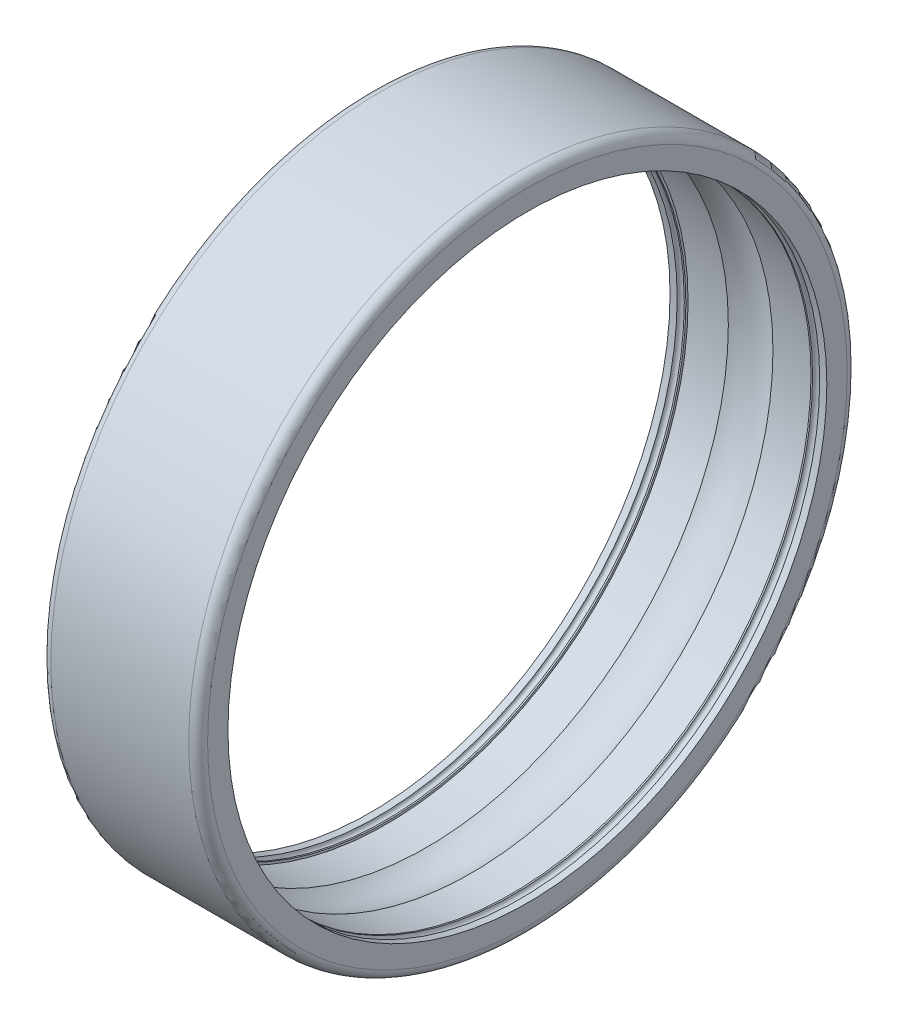
ISO-10303-21;
HEADER;
FILE_DESCRIPTION(('STEP AP214'),'2;1');
FILE_NAME('part.step','',(''),(''),'','','');
FILE_SCHEMA(('AUTOMOTIVE_DESIGN { 1 0 10303 214 1 1 1 1 }'));
ENDSEC;
DATA;
#1=APPLICATION_CONTEXT('core data for automotive mechanical design processes');
#2=APPLICATION_PROTOCOL_DEFINITION('international standard','automotive_design',2000,#1);
#3=PRODUCT_CONTEXT('',#1,'mechanical');
#4=PRODUCT('Part','Part','',(#3));
#5=PRODUCT_RELATED_PRODUCT_CATEGORY('part','',(#4));
#6=PRODUCT_DEFINITION_FORMATION('','',#4);
#7=PRODUCT_DEFINITION_CONTEXT('part definition',#1,'design');
#8=PRODUCT_DEFINITION('design','',#6,#7);
#9=PRODUCT_DEFINITION_SHAPE('','',#8);
#10=(LENGTH_UNIT() NAMED_UNIT(*) SI_UNIT(.MILLI.,.METRE.));
#11=(NAMED_UNIT(*) PLANE_ANGLE_UNIT() SI_UNIT($,.RADIAN.));
#12=(NAMED_UNIT(*) SI_UNIT($,.STERADIAN.) SOLID_ANGLE_UNIT());
#13=UNCERTAINTY_MEASURE_WITH_UNIT(LENGTH_MEASURE(1.E-05),#10,'distance_accuracy_value','');
#14=(GEOMETRIC_REPRESENTATION_CONTEXT(3) GLOBAL_UNCERTAINTY_ASSIGNED_CONTEXT((#13)) GLOBAL_UNIT_ASSIGNED_CONTEXT((#10,
#11,#12)) REPRESENTATION_CONTEXT('',''));
#15=CARTESIAN_POINT('',(0.,0.,0.));
#16=DIRECTION('',(0.,0.,1.));
#17=DIRECTION('',(1.,0.,0.));
#18=AXIS2_PLACEMENT_3D('',#15,#16,#17);
#19=CARTESIAN_POINT('',(0.,10.2,0.));
#20=DIRECTION('',(1.,0.,0.));
#21=DIRECTION('',(0.,0.,-1.));
#22=AXIS2_PLACEMENT_3D('',#19,#20,#21);
#23=PLANE('',#22);
#24=CARTESIAN_POINT('',(0.,0.,0.));
#25=DIRECTION('',(-1.,0.,0.));
#26=DIRECTION('',(0.,0.,1.));
#27=AXIS2_PLACEMENT_3D('',#24,#25,#26);
#28=CIRCLE('',#27,9.55);
#29=CARTESIAN_POINT('',(0.,0.,9.55));
#30=VERTEX_POINT('',#29);
#31=EDGE_CURVE('E10',#30,#30,#28,.T.);
#32=ORIENTED_EDGE('',*,*,#31,.F.);
#33=EDGE_LOOP('',(#32));
#34=FACE_BOUND('',#33,.T.);
#35=CARTESIAN_POINT('',(0.,0.,0.));
#36=DIRECTION('',(-1.,0.,0.));
#37=DIRECTION('',(0.,0.,1.));
#38=AXIS2_PLACEMENT_3D('',#35,#36,#37);
#39=CIRCLE('',#38,10.2);
#40=CARTESIAN_POINT('',(0.,0.,10.2));
#41=VERTEX_POINT('',#40);
#42=EDGE_CURVE('E88',#41,#41,#39,.T.);
#43=ORIENTED_EDGE('',*,*,#42,.T.);
#44=EDGE_LOOP('',(#43));
#45=FACE_BOUND('',#44,.T.);
#46=ADVANCED_FACE('F14',(#34,#45),#23,.F.);
#47=CARTESIAN_POINT('',(2.5,0.,0.));
#48=DIRECTION('',(-1.,0.,0.));
#49=DIRECTION('',(0.,0.,1.));
#50=AXIS2_PLACEMENT_3D('',#47,#48,#49);
#51=CYLINDRICAL_SURFACE('',#50,9.55);
#52=CARTESIAN_POINT('',(0.227272727272727,0.,0.));
#53=DIRECTION('',(-1.,0.,0.));
#54=DIRECTION('',(0.,0.,1.));
#55=AXIS2_PLACEMENT_3D('',#52,#53,#54);
#56=CIRCLE('',#55,9.55);
#57=CARTESIAN_POINT('',(0.227272727272727,0.,9.55));
#58=VERTEX_POINT('',#57);
#59=EDGE_CURVE('E21',#58,#58,#56,.T.);
#60=ORIENTED_EDGE('',*,*,#59,.F.);
#61=EDGE_LOOP('',(#60));
#62=FACE_BOUND('',#61,.T.);
#63=ORIENTED_EDGE('',*,*,#31,.T.);
#64=EDGE_LOOP('',(#63));
#65=FACE_BOUND('',#64,.T.);
#66=ADVANCED_FACE('F137',(#62,#65),#51,.F.);
#67=CARTESIAN_POINT('',(0.34090909090909,0.,0.));
#68=DIRECTION('',(-1.,0.,0.));
#69=DIRECTION('',(0.,0.,1.));
#70=AXIS2_PLACEMENT_3D('',#67,#68,#69);
#71=TOROIDAL_SURFACE('',#70,9.55,0.113636363636364);
#72=ORIENTED_EDGE('',*,*,#59,.T.);
#73=EDGE_LOOP('',(#72));
#74=FACE_BOUND('',#73,.T.);
#75=CARTESIAN_POINT('',(0.454545454545454,0.,0.));
#76=DIRECTION('',(-1.,0.,0.));
#77=DIRECTION('',(0.,0.,1.));
#78=AXIS2_PLACEMENT_3D('',#75,#76,#77);
#79=CIRCLE('',#78,9.55);
#80=CARTESIAN_POINT('',(0.454545454545454,0.,9.55));
#81=VERTEX_POINT('',#80);
#82=EDGE_CURVE('E30',#81,#81,#79,.T.);
#83=ORIENTED_EDGE('',*,*,#82,.F.);
#84=EDGE_LOOP('',(#83));
#85=FACE_BOUND('',#84,.T.);
#86=ADVANCED_FACE('F142',(#74,#85),#71,.F.);
#87=CARTESIAN_POINT('',(2.5,0.,0.));
#88=DIRECTION('',(-1.,0.,0.));
#89=DIRECTION('',(0.,0.,1.));
#90=AXIS2_PLACEMENT_3D('',#87,#88,#89);
#91=CYLINDRICAL_SURFACE('',#90,9.55);
#92=CARTESIAN_POINT('',(0.504545454545455,0.,0.));
#93=DIRECTION('',(-1.,0.,0.));
#94=DIRECTION('',(0.,0.,1.));
#95=AXIS2_PLACEMENT_3D('',#92,#93,#94);
#96=CIRCLE('',#95,9.55);
#97=CARTESIAN_POINT('',(0.504545454545455,0.,9.55));
#98=VERTEX_POINT('',#97);
#99=EDGE_CURVE('E38',#98,#98,#96,.T.);
#100=ORIENTED_EDGE('',*,*,#99,.F.);
#101=EDGE_LOOP('',(#100));
#102=FACE_BOUND('',#101,.T.);
#103=ORIENTED_EDGE('',*,*,#82,.T.);
#104=EDGE_LOOP('',(#103));
#105=FACE_BOUND('',#104,.T.);
#106=ADVANCED_FACE('F147',(#102,#105),#91,.F.);
#107=CARTESIAN_POINT('',(0.504545454545455,9.55,0.));
#108=DIRECTION('',(-1.,0.,0.));
#109=DIRECTION('',(0.,0.,1.));
#110=AXIS2_PLACEMENT_3D('',#107,#108,#109);
#111=PLANE('',#110);
#112=CARTESIAN_POINT('',(0.504545454545455,0.,0.));
#113=DIRECTION('',(-1.,0.,0.));
#114=DIRECTION('',(0.,0.,1.));
#115=AXIS2_PLACEMENT_3D('',#112,#113,#114);
#116=CIRCLE('',#115,9.62045454545455);
#117=CARTESIAN_POINT('',(0.504545454545455,0.,9.62045454545455));
#118=VERTEX_POINT('',#117);
#119=EDGE_CURVE('E44',#118,#118,#116,.T.);
#120=ORIENTED_EDGE('',*,*,#119,.F.);
#121=EDGE_LOOP('',(#120));
#122=FACE_BOUND('',#121,.T.);
#123=ORIENTED_EDGE('',*,*,#99,.T.);
#124=EDGE_LOOP('',(#123));
#125=FACE_BOUND('',#124,.T.);
#126=ADVANCED_FACE('F152',(#122,#125),#111,.F.);
#127=CARTESIAN_POINT('',(2.5,0.,0.));
#128=DIRECTION('',(-1.,0.,0.));
#129=DIRECTION('',(0.,0.,1.));
#130=AXIS2_PLACEMENT_3D('',#127,#128,#129);
#131=CYLINDRICAL_SURFACE('',#130,9.62045454545455);
#132=CARTESIAN_POINT('',(1.78838227018404,0.,0.));
#133=DIRECTION('',(-1.,0.,0.));
#134=DIRECTION('',(0.,0.,1.));
#135=AXIS2_PLACEMENT_3D('',#132,#133,#134);
#136=CIRCLE('',#135,9.62045454545455);
#137=CARTESIAN_POINT('',(1.78838227018404,0.,9.62045454545455));
#138=VERTEX_POINT('',#137);
#139=EDGE_CURVE('E48',#138,#138,#136,.T.);
#140=ORIENTED_EDGE('',*,*,#139,.F.);
#141=EDGE_LOOP('',(#140));
#142=FACE_BOUND('',#141,.T.);
#143=ORIENTED_EDGE('',*,*,#119,.T.);
#144=EDGE_LOOP('',(#143));
#145=FACE_BOUND('',#144,.T.);
#146=ADVANCED_FACE('F156',(#142,#145),#131,.F.);
#147=CARTESIAN_POINT('',(2.5,0.,0.));
#148=DIRECTION('',(-1.,0.,0.));
#149=DIRECTION('',(0.,0.,1.));
#150=AXIS2_PLACEMENT_3D('',#147,#148,#149);
#151=TOROIDAL_SURFACE('',#150,8.3,1.5);
#152=ORIENTED_EDGE('',*,*,#139,.T.);
#153=EDGE_LOOP('',(#152));
#154=FACE_BOUND('',#153,.T.);
#155=CARTESIAN_POINT('',(3.21161772981596,0.,0.));
#156=DIRECTION('',(-1.,0.,0.));
#157=DIRECTION('',(0.,0.,1.));
#158=AXIS2_PLACEMENT_3D('',#155,#156,#157);
#159=CIRCLE('',#158,9.62045454545455);
#160=CARTESIAN_POINT('',(3.21161772981596,0.,9.62045454545455));
#161=VERTEX_POINT('',#160);
#162=EDGE_CURVE('E52',#161,#161,#159,.T.);
#163=ORIENTED_EDGE('',*,*,#162,.F.);
#164=EDGE_LOOP('',(#163));
#165=FACE_BOUND('',#164,.T.);
#166=ADVANCED_FACE('F160',(#154,#165),#151,.F.);
#167=CARTESIAN_POINT('',(2.5,0.,0.));
#168=DIRECTION('',(-1.,0.,0.));
#169=DIRECTION('',(0.,0.,1.));
#170=AXIS2_PLACEMENT_3D('',#167,#168,#169);
#171=CYLINDRICAL_SURFACE('',#170,9.62045454545455);
#172=CARTESIAN_POINT('',(4.49545454545454,0.,0.));
#173=DIRECTION('',(-1.,0.,0.));
#174=DIRECTION('',(0.,0.,1.));
#175=AXIS2_PLACEMENT_3D('',#172,#173,#174);
#176=CIRCLE('',#175,9.62045454545455);
#177=CARTESIAN_POINT('',(4.49545454545454,0.,9.62045454545455));
#178=VERTEX_POINT('',#177);
#179=EDGE_CURVE('E56',#178,#178,#176,.T.);
#180=ORIENTED_EDGE('',*,*,#179,.F.);
#181=EDGE_LOOP('',(#180));
#182=FACE_BOUND('',#181,.T.);
#183=ORIENTED_EDGE('',*,*,#162,.T.);
#184=EDGE_LOOP('',(#183));
#185=FACE_BOUND('',#184,.T.);
#186=ADVANCED_FACE('F164',(#182,#185),#171,.F.);
#187=CARTESIAN_POINT('',(4.49545454545454,9.62045454545455,0.));
#188=DIRECTION('',(1.,0.,0.));
#189=DIRECTION('',(0.,0.,-1.));
#190=AXIS2_PLACEMENT_3D('',#187,#188,#189);
#191=PLANE('',#190);
#192=CARTESIAN_POINT('',(4.49545454545454,0.,0.));
#193=DIRECTION('',(-1.,0.,0.));
#194=DIRECTION('',(0.,0.,1.));
#195=AXIS2_PLACEMENT_3D('',#192,#193,#194);
#196=CIRCLE('',#195,9.55);
#197=CARTESIAN_POINT('',(4.49545454545454,0.,9.55));
#198=VERTEX_POINT('',#197);
#199=EDGE_CURVE('E60',#198,#198,#196,.T.);
#200=ORIENTED_EDGE('',*,*,#199,.F.);
#201=EDGE_LOOP('',(#200));
#202=FACE_BOUND('',#201,.T.);
#203=ORIENTED_EDGE('',*,*,#179,.T.);
#204=EDGE_LOOP('',(#203));
#205=FACE_BOUND('',#204,.T.);
#206=ADVANCED_FACE('F133',(#202,#205),#191,.F.);
#207=CARTESIAN_POINT('',(2.5,0.,0.));
#208=DIRECTION('',(-1.,0.,0.));
#209=DIRECTION('',(0.,0.,1.));
#210=AXIS2_PLACEMENT_3D('',#207,#208,#209);
#211=CYLINDRICAL_SURFACE('',#210,9.55);
#212=CARTESIAN_POINT('',(4.54545454545455,0.,0.));
#213=DIRECTION('',(-1.,0.,0.));
#214=DIRECTION('',(0.,0.,1.));
#215=AXIS2_PLACEMENT_3D('',#212,#213,#214);
#216=CIRCLE('',#215,9.55);
#217=CARTESIAN_POINT('',(4.54545454545455,0.,9.55));
#218=VERTEX_POINT('',#217);
#219=EDGE_CURVE('E64',#218,#218,#216,.T.);
#220=ORIENTED_EDGE('',*,*,#219,.F.);
#221=EDGE_LOOP('',(#220));
#222=FACE_BOUND('',#221,.T.);
#223=ORIENTED_EDGE('',*,*,#199,.T.);
#224=EDGE_LOOP('',(#223));
#225=FACE_BOUND('',#224,.T.);
#226=ADVANCED_FACE('F126',(#222,#225),#211,.F.);
#227=CARTESIAN_POINT('',(4.65909090909091,0.,0.));
#228=DIRECTION('',(-1.,0.,0.));
#229=DIRECTION('',(0.,0.,1.));
#230=AXIS2_PLACEMENT_3D('',#227,#228,#229);
#231=TOROIDAL_SURFACE('',#230,9.55,0.113636363636364);
#232=ORIENTED_EDGE('',*,*,#219,.T.);
#233=EDGE_LOOP('',(#232));
#234=FACE_BOUND('',#233,.T.);
#235=CARTESIAN_POINT('',(4.77272727272727,0.,0.));
#236=DIRECTION('',(-1.,0.,0.));
#237=DIRECTION('',(0.,0.,1.));
#238=AXIS2_PLACEMENT_3D('',#235,#236,#237);
#239=CIRCLE('',#238,9.55);
#240=CARTESIAN_POINT('',(4.77272727272727,0.,9.55));
#241=VERTEX_POINT('',#240);
#242=EDGE_CURVE('E68',#241,#241,#239,.T.);
#243=ORIENTED_EDGE('',*,*,#242,.F.);
#244=EDGE_LOOP('',(#243));
#245=FACE_BOUND('',#244,.T.);
#246=ADVANCED_FACE('F121',(#234,#245),#231,.F.);
#247=CARTESIAN_POINT('',(2.5,0.,0.));
#248=DIRECTION('',(-1.,0.,0.));
#249=DIRECTION('',(0.,0.,1.));
#250=AXIS2_PLACEMENT_3D('',#247,#248,#249);
#251=CYLINDRICAL_SURFACE('',#250,9.55);
#252=CARTESIAN_POINT('',(5.,0.,0.));
#253=DIRECTION('',(-1.,0.,0.));
#254=DIRECTION('',(0.,0.,1.));
#255=AXIS2_PLACEMENT_3D('',#252,#253,#254);
#256=CIRCLE('',#255,9.55);
#257=CARTESIAN_POINT('',(5.,0.,9.55));
#258=VERTEX_POINT('',#257);
#259=EDGE_CURVE('E72',#258,#258,#256,.T.);
#260=ORIENTED_EDGE('',*,*,#259,.F.);
#261=EDGE_LOOP('',(#260));
#262=FACE_BOUND('',#261,.T.);
#263=ORIENTED_EDGE('',*,*,#242,.T.);
#264=EDGE_LOOP('',(#263));
#265=FACE_BOUND('',#264,.T.);
#266=ADVANCED_FACE('F115',(#262,#265),#251,.F.);
#267=CARTESIAN_POINT('',(5.,9.55,0.));
#268=DIRECTION('',(-1.,0.,0.));
#269=DIRECTION('',(0.,0.,1.));
#270=AXIS2_PLACEMENT_3D('',#267,#268,#269);
#271=PLANE('',#270);
#272=CARTESIAN_POINT('',(5.,0.,0.));
#273=DIRECTION('',(-1.,0.,0.));
#274=DIRECTION('',(0.,0.,1.));
#275=AXIS2_PLACEMENT_3D('',#272,#273,#274);
#276=CIRCLE('',#275,10.2);
#277=CARTESIAN_POINT('',(5.,0.,10.2));
#278=VERTEX_POINT('',#277);
#279=EDGE_CURVE('E76',#278,#278,#276,.T.);
#280=ORIENTED_EDGE('',*,*,#279,.F.);
#281=EDGE_LOOP('',(#280));
#282=FACE_BOUND('',#281,.T.);
#283=ORIENTED_EDGE('',*,*,#259,.T.);
#284=EDGE_LOOP('',(#283));
#285=FACE_BOUND('',#284,.T.);
#286=ADVANCED_FACE('F109',(#282,#285),#271,.F.);
#287=CARTESIAN_POINT('',(4.7,0.,0.));
#288=DIRECTION('',(-1.,0.,0.));
#289=DIRECTION('',(0.,0.,1.));
#290=AXIS2_PLACEMENT_3D('',#287,#288,#289);
#291=TOROIDAL_SURFACE('',#290,10.2,0.3);
#292=CARTESIAN_POINT('',(4.7,0.,0.));
#293=DIRECTION('',(-1.,0.,0.));
#294=DIRECTION('',(0.,0.,1.));
#295=AXIS2_PLACEMENT_3D('',#292,#293,#294);
#296=CIRCLE('',#295,10.5);
#297=CARTESIAN_POINT('',(4.7,0.,10.5));
#298=VERTEX_POINT('',#297);
#299=EDGE_CURVE('E80',#298,#298,#296,.T.);
#300=ORIENTED_EDGE('',*,*,#299,.F.);
#301=EDGE_LOOP('',(#300));
#302=FACE_BOUND('',#301,.T.);
#303=ORIENTED_EDGE('',*,*,#279,.T.);
#304=EDGE_LOOP('',(#303));
#305=FACE_BOUND('',#304,.T.);
#306=ADVANCED_FACE('F103',(#302,#305),#291,.T.);
#307=CARTESIAN_POINT('',(2.5,0.,0.));
#308=DIRECTION('',(-1.,0.,0.));
#309=DIRECTION('',(0.,0.,1.));
#310=AXIS2_PLACEMENT_3D('',#307,#308,#309);
#311=CYLINDRICAL_SURFACE('',#310,10.5);
#312=CARTESIAN_POINT('',(0.3,0.,0.));
#313=DIRECTION('',(-1.,0.,0.));
#314=DIRECTION('',(0.,0.,1.));
#315=AXIS2_PLACEMENT_3D('',#312,#313,#314);
#316=CIRCLE('',#315,10.5);
#317=CARTESIAN_POINT('',(0.3,0.,10.5));
#318=VERTEX_POINT('',#317);
#319=EDGE_CURVE('E84',#318,#318,#316,.T.);
#320=ORIENTED_EDGE('',*,*,#319,.F.);
#321=EDGE_LOOP('',(#320));
#322=FACE_BOUND('',#321,.T.);
#323=ORIENTED_EDGE('',*,*,#299,.T.);
#324=EDGE_LOOP('',(#323));
#325=FACE_BOUND('',#324,.T.);
#326=ADVANCED_FACE('F97',(#322,#325),#311,.T.);
#327=CARTESIAN_POINT('',(0.3,0.,0.));
#328=DIRECTION('',(-1.,0.,0.));
#329=DIRECTION('',(0.,0.,1.));
#330=AXIS2_PLACEMENT_3D('',#327,#328,#329);
#331=TOROIDAL_SURFACE('',#330,10.2,0.3);
#332=ORIENTED_EDGE('',*,*,#42,.F.);
#333=EDGE_LOOP('',(#332));
#334=FACE_BOUND('',#333,.T.);
#335=ORIENTED_EDGE('',*,*,#319,.T.);
#336=EDGE_LOOP('',(#335));
#337=FACE_BOUND('',#336,.T.);
#338=ADVANCED_FACE('F94',(#334,#337),#331,.T.);
#339=CLOSED_SHELL('',(#46,#66,#86,#106,#126,#146,#166,#186,#206,#226,#246,#266,#286,#306,#326,#338));
#340=MANIFOLD_SOLID_BREP('B1',#339);
#341=ADVANCED_BREP_SHAPE_REPRESENTATION('',(#18,#340),#14);
#342=SHAPE_DEFINITION_REPRESENTATION(#9,#341);
ENDSEC;
END-ISO-10303-21;
